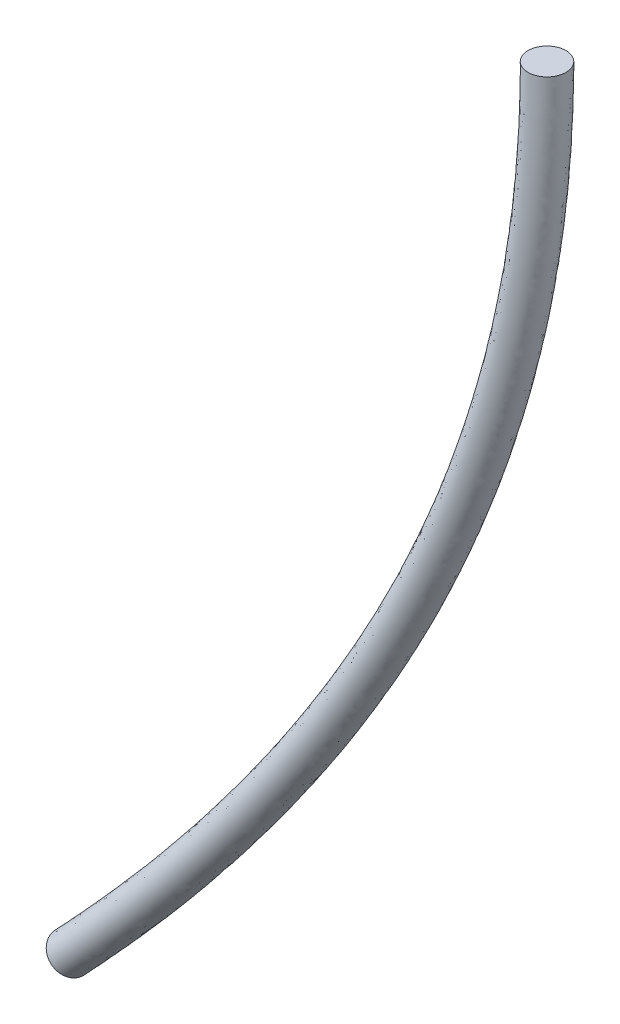
ISO-10303-21;
HEADER;
FILE_DESCRIPTION(('STEP AP214'),'2;1');
FILE_NAME('part.step','',(''),(''),'','','');
FILE_SCHEMA(('AUTOMOTIVE_DESIGN { 1 0 10303 214 1 1 1 1 }'));
ENDSEC;
DATA;
#1=APPLICATION_CONTEXT('core data for automotive mechanical design processes');
#2=APPLICATION_PROTOCOL_DEFINITION('international standard','automotive_design',2000,#1);
#3=PRODUCT_CONTEXT('',#1,'mechanical');
#4=PRODUCT('Part','Part','',(#3));
#5=PRODUCT_RELATED_PRODUCT_CATEGORY('part','',(#4));
#6=PRODUCT_DEFINITION_FORMATION('','',#4);
#7=PRODUCT_DEFINITION_CONTEXT('part definition',#1,'design');
#8=PRODUCT_DEFINITION('design','',#6,#7);
#9=PRODUCT_DEFINITION_SHAPE('','',#8);
#10=(LENGTH_UNIT() NAMED_UNIT(*) SI_UNIT(.MILLI.,.METRE.));
#11=(NAMED_UNIT(*) PLANE_ANGLE_UNIT() SI_UNIT($,.RADIAN.));
#12=(NAMED_UNIT(*) SI_UNIT($,.STERADIAN.) SOLID_ANGLE_UNIT());
#13=UNCERTAINTY_MEASURE_WITH_UNIT(LENGTH_MEASURE(1.E-05),#10,'distance_accuracy_value','');
#14=(GEOMETRIC_REPRESENTATION_CONTEXT(3) GLOBAL_UNCERTAINTY_ASSIGNED_CONTEXT((#13)) GLOBAL_UNIT_ASSIGNED_CONTEXT((#10,
#11,#12)) REPRESENTATION_CONTEXT('',''));
#15=CARTESIAN_POINT('',(0.,0.,0.));
#16=DIRECTION('',(0.,0.,1.));
#17=DIRECTION('',(1.,0.,0.));
#18=AXIS2_PLACEMENT_3D('',#15,#16,#17);
#19=CARTESIAN_POINT('',(0.,0.,0.));
#20=DIRECTION('',(0.,1.,0.));
#21=DIRECTION('',(0.,0.,1.));
#22=AXIS2_PLACEMENT_3D('',#19,#20,#21);
#23=PLANE('',#22);
#24=CARTESIAN_POINT('',(0.,0.,0.));
#25=DIRECTION('',(0.,1.,0.));
#26=DIRECTION('',(0.,0.,1.));
#27=AXIS2_PLACEMENT_3D('',#24,#25,#26);
#28=CIRCLE('',#27,1.5);
#29=CARTESIAN_POINT('',(0.,0.,1.5));
#30=VERTEX_POINT('',#29);
#31=EDGE_CURVE('E42',#30,#30,#28,.T.);
#32=ORIENTED_EDGE('',*,*,#31,.T.);
#33=EDGE_LOOP('',(#32));
#34=FACE_BOUND('',#33,.T.);
#35=ADVANCED_FACE('F35',(#34),#23,.T.);
#36=CARTESIAN_POINT('',(-37.7967059277272,-80.,0.));
#37=DIRECTION('',(0.686805302503118,0.726841438316227,0.));
#38=DIRECTION('',(0.,0.,1.));
#39=AXIS2_PLACEMENT_3D('',#36,#37,#38);
#40=PLANE('',#39);
#41=CARTESIAN_POINT('',(-37.7967059277272,-80.,0.));
#42=DIRECTION('',(0.686805302503118,0.726841438316227,0.));
#43=DIRECTION('',(0.,0.,1.));
#44=AXIS2_PLACEMENT_3D('',#41,#42,#43);
#45=CIRCLE('',#44,1.5);
#46=CARTESIAN_POINT('',(-37.7967059277272,-80.,1.5));
#47=VERTEX_POINT('',#46);
#48=EDGE_CURVE('E11',#47,#47,#45,.T.);
#49=ORIENTED_EDGE('',*,*,#48,.F.);
#50=EDGE_LOOP('',(#49));
#51=FACE_BOUND('',#50,.T.);
#52=ADVANCED_FACE('F51',(#51),#40,.F.);
#53=CARTESIAN_POINT('',(0.,0.,1.5));
#54=CARTESIAN_POINT('',(0.,-13.3333333333333,1.5));
#55=CARTESIAN_POINT('',(-3.14972549398061,-26.6666666666994,1.5));
#56=CARTESIAN_POINT('',(-15.748627469883,-53.3333333333006,1.5));
#57=CARTESIAN_POINT('',(-25.1978039520448,-66.6666666661983,1.5));
#58=CARTESIAN_POINT('',(-37.7967059277272,-80.,1.5));
#59=CARTESIAN_POINT('',(3.,0.,1.5));
#60=CARTESIAN_POINT('',(3.00000000001446,-13.8057921574958,1.5));
#61=CARTESIAN_POINT('',(-0.272231762634536,-27.5989827529032,1.5));
#62=CARTESIAN_POINT('',(-13.2011250319361,-54.9641045579695,1.5));
#63=CARTESIAN_POINT('',(-22.8458535302753,-68.5456634761497,1.5));
#64=CARTESIAN_POINT('',(-35.6161816127785,-82.0604159075094,1.5));
#65=CARTESIAN_POINT('',(3.,0.,-1.5));
#66=CARTESIAN_POINT('',(3.00000000001446,-13.8057921574958,-1.5));
#67=CARTESIAN_POINT('',(-0.272231762634536,-27.5989827529032,-1.5));
#68=CARTESIAN_POINT('',(-13.2011250319361,-54.9641045579695,-1.5));
#69=CARTESIAN_POINT('',(-22.8458535302753,-68.5456634761497,-1.5));
#70=CARTESIAN_POINT('',(-35.6161816127785,-82.0604159075094,-1.5));
#71=CARTESIAN_POINT('',(0.,0.,-1.5));
#72=CARTESIAN_POINT('',(0.,-13.3333333333333,-1.5));
#73=CARTESIAN_POINT('',(-3.14972549398061,-26.6666666666994,-1.5));
#74=CARTESIAN_POINT('',(-15.748627469883,-53.3333333333006,-1.5));
#75=CARTESIAN_POINT('',(-25.1978039520448,-66.6666666661983,-1.5));
#76=CARTESIAN_POINT('',(-37.7967059277272,-80.,-1.5));
#77=CARTESIAN_POINT('',(-3.,0.,-1.5));
#78=CARTESIAN_POINT('',(-3.00000000001446,-12.8608745091708,-1.5));
#79=CARTESIAN_POINT('',(-6.02721922532669,-25.7343505804956,-1.5));
#80=CARTESIAN_POINT('',(-18.2961299078299,-51.7025621086317,-1.5));
#81=CARTESIAN_POINT('',(-27.5497543738142,-64.7876698562468,-1.5));
#82=CARTESIAN_POINT('',(-39.9772302426759,-77.9395840924906,-1.5));
#83=CARTESIAN_POINT('',(-3.,0.,1.5));
#84=CARTESIAN_POINT('',(-3.00000000001446,-12.8608745091708,1.5));
#85=CARTESIAN_POINT('',(-6.02721922532669,-25.7343505804956,1.5));
#86=CARTESIAN_POINT('',(-18.2961299078299,-51.7025621086317,1.5));
#87=CARTESIAN_POINT('',(-27.5497543738142,-64.7876698562468,1.5));
#88=CARTESIAN_POINT('',(-39.9772302426759,-77.9395840924906,1.5));
#89=CARTESIAN_POINT('',(0.,0.,1.5));
#90=CARTESIAN_POINT('',(0.,-13.3333333333333,1.5));
#91=CARTESIAN_POINT('',(-3.14972549398061,-26.6666666666994,1.5));
#92=CARTESIAN_POINT('',(-15.748627469883,-53.3333333333006,1.5));
#93=CARTESIAN_POINT('',(-25.1978039520448,-66.6666666661983,1.5));
#94=CARTESIAN_POINT('',(-37.7967059277272,-80.,1.5));
#95=(BOUNDED_SURFACE() B_SPLINE_SURFACE(3,3,((#53,#54,#55,#56,#57,#58),(#59,#60,#61,#62,#63,
#64),(#65,#66,#67,#68,#69,#70),(#71,#72,#73,#74,#75,#76),(#77,#78,#79,#80,#81,#82),(#83,#84,#85,
#86,#87,#88),(#89,#90,#91,#92,#93,#94)),.UNSPECIFIED.,.T.,.F.,
.F.) B_SPLINE_SURFACE_WITH_KNOTS((4,3,4),(4,2,4),(0.,0.5,1.),(0.,0.5,1.),
.UNSPECIFIED.) GEOMETRIC_REPRESENTATION_ITEM() RATIONAL_B_SPLINE_SURFACE(((1.,1.,1.,1.,1.,1.),
(0.333333333333333,0.333333333333333,0.333333333333333,0.333333333333333,0.333333333333333,
0.333333333333333),(0.333333333333333,0.333333333333333,0.333333333333333,0.333333333333333,
0.333333333333333,0.333333333333333),(1.,1.,1.,1.,1.,1.),(0.333333333333333,0.333333333333333,
0.333333333333333,0.333333333333333,0.333333333333333,0.333333333333333),(0.333333333333333,
0.333333333333333,0.333333333333333,0.333333333333333,0.333333333333333,0.333333333333333),(1.,
1.,1.,1.,1.,1.))) REPRESENTATION_ITEM('') SURFACE());
#96=ORIENTED_EDGE('',*,*,#48,.T.);
#97=EDGE_LOOP('',(#96));
#98=FACE_BOUND('',#97,.T.);
#99=ORIENTED_EDGE('',*,*,#31,.F.);
#100=EDGE_LOOP('',(#99));
#101=FACE_BOUND('',#100,.T.);
#102=ADVANCED_FACE('F49',(#98,#101),#95,.F.);
#103=CLOSED_SHELL('',(#35,#52,#102));
#104=MANIFOLD_SOLID_BREP('B2',#103);
#105=ADVANCED_BREP_SHAPE_REPRESENTATION('',(#18,#104),#14);
#106=SHAPE_DEFINITION_REPRESENTATION(#9,#105);
ENDSEC;
END-ISO-10303-21;
